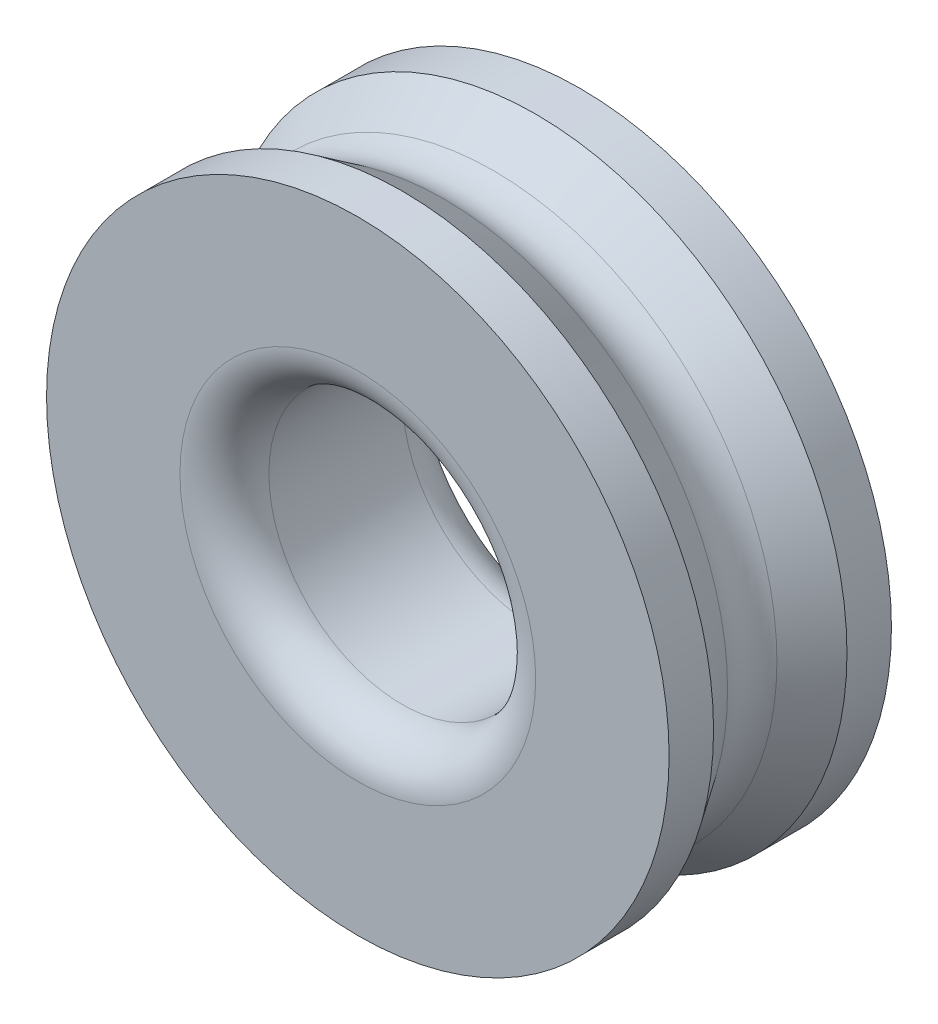
ISO-10303-21;
HEADER;
FILE_DESCRIPTION(('STEP AP214'),'2;1');
FILE_NAME('part.step','',(''),(''),'','','');
FILE_SCHEMA(('AUTOMOTIVE_DESIGN { 1 0 10303 214 1 1 1 1 }'));
ENDSEC;
DATA;
#1=APPLICATION_CONTEXT('core data for automotive mechanical design processes');
#2=APPLICATION_PROTOCOL_DEFINITION('international standard','automotive_design',2000,#1);
#3=PRODUCT_CONTEXT('',#1,'mechanical');
#4=PRODUCT('Part','Part','',(#3));
#5=PRODUCT_RELATED_PRODUCT_CATEGORY('part','',(#4));
#6=PRODUCT_DEFINITION_FORMATION('','',#4);
#7=PRODUCT_DEFINITION_CONTEXT('part definition',#1,'design');
#8=PRODUCT_DEFINITION('design','',#6,#7);
#9=PRODUCT_DEFINITION_SHAPE('','',#8);
#10=(LENGTH_UNIT() NAMED_UNIT(*) SI_UNIT(.MILLI.,.METRE.));
#11=(NAMED_UNIT(*) PLANE_ANGLE_UNIT() SI_UNIT($,.RADIAN.));
#12=(NAMED_UNIT(*) SI_UNIT($,.STERADIAN.) SOLID_ANGLE_UNIT());
#13=UNCERTAINTY_MEASURE_WITH_UNIT(LENGTH_MEASURE(1.E-05),#10,'distance_accuracy_value','');
#14=(GEOMETRIC_REPRESENTATION_CONTEXT(3) GLOBAL_UNCERTAINTY_ASSIGNED_CONTEXT((#13)) GLOBAL_UNIT_ASSIGNED_CONTEXT((#10,
#11,#12)) REPRESENTATION_CONTEXT('',''));
#15=CARTESIAN_POINT('',(0.,0.,0.));
#16=DIRECTION('',(0.,0.,1.));
#17=DIRECTION('',(1.,0.,0.));
#18=AXIS2_PLACEMENT_3D('',#15,#16,#17);
#19=CARTESIAN_POINT('',(0.,0.,0.));
#20=DIRECTION('',(0.,0.,1.));
#21=DIRECTION('',(1.,0.,0.));
#22=AXIS2_PLACEMENT_3D('',#19,#20,#21);
#23=CONICAL_SURFACE('',#22,7.,0.588002603547568);
#24=CARTESIAN_POINT('',(0.,0.,-0.94529980377477));
#25=DIRECTION('',(0.,0.,1.));
#26=DIRECTION('',(1.,0.,0.));
#27=AXIS2_PLACEMENT_3D('',#24,#25,#26);
#28=CIRCLE('',#27,6.36980013081682);
#29=CARTESIAN_POINT('',(6.36980013081682,0.,-0.94529980377477));
#30=VERTEX_POINT('',#29);
#31=EDGE_CURVE('E52',#30,#30,#28,.T.);
#32=ORIENTED_EDGE('',*,*,#31,.T.);
#33=EDGE_LOOP('',(#32));
#34=FACE_BOUND('',#33,.T.);
#35=CARTESIAN_POINT('',(0.,0.,0.));
#36=DIRECTION('',(0.,0.,1.));
#37=DIRECTION('',(1.,0.,0.));
#38=AXIS2_PLACEMENT_3D('',#35,#36,#37);
#39=CIRCLE('',#38,7.);
#40=CARTESIAN_POINT('',(7.,0.,0.));
#41=VERTEX_POINT('',#40);
#42=EDGE_CURVE('E55',#41,#41,#39,.T.);
#43=ORIENTED_EDGE('',*,*,#42,.F.);
#44=EDGE_LOOP('',(#43));
#45=FACE_BOUND('',#44,.T.);
#46=ADVANCED_FACE('F29',(#34,#45),#23,.T.);
#47=CARTESIAN_POINT('',(0.,0.,-1.5));
#48=DIRECTION('',(0.,0.,-1.));
#49=DIRECTION('',(-1.,0.,0.));
#50=AXIS2_PLACEMENT_3D('',#47,#48,#49);
#51=CONICAL_SURFACE('',#50,6.,0.588002603547568);
#52=CARTESIAN_POINT('',(0.,0.,-2.05470019622523));
#53=DIRECTION('',(0.,0.,-1.));
#54=DIRECTION('',(-1.,0.,0.));
#55=AXIS2_PLACEMENT_3D('',#52,#53,#54);
#56=CIRCLE('',#55,6.36980013081682);
#57=CARTESIAN_POINT('',(-6.36980013081682,0.,-2.05470019622523));
#58=VERTEX_POINT('',#57);
#59=EDGE_CURVE('E49',#58,#58,#56,.T.);
#60=ORIENTED_EDGE('',*,*,#59,.T.);
#61=EDGE_LOOP('',(#60));
#62=FACE_BOUND('',#61,.T.);
#63=CARTESIAN_POINT('',(0.,0.,-3.));
#64=DIRECTION('',(0.,0.,-1.));
#65=DIRECTION('',(-1.,0.,0.));
#66=AXIS2_PLACEMENT_3D('',#63,#64,#65);
#67=CIRCLE('',#66,7.);
#68=CARTESIAN_POINT('',(-7.,0.,-3.));
#69=VERTEX_POINT('',#68);
#70=EDGE_CURVE('E59',#69,#69,#67,.T.);
#71=ORIENTED_EDGE('',*,*,#70,.F.);
#72=EDGE_LOOP('',(#71));
#73=FACE_BOUND('',#72,.T.);
#74=ADVANCED_FACE('F78',(#62,#73),#51,.T.);
#75=CARTESIAN_POINT('',(0.,0.,-4.));
#76=DIRECTION('',(0.,0.,1.));
#77=DIRECTION('',(1.,0.,0.));
#78=AXIS2_PLACEMENT_3D('',#75,#76,#77);
#79=CYLINDRICAL_SURFACE('',#78,7.);
#80=CARTESIAN_POINT('',(0.,0.,-4.));
#81=DIRECTION('',(0.,0.,-1.));
#82=DIRECTION('',(-1.,0.,0.));
#83=AXIS2_PLACEMENT_3D('',#80,#81,#82);
#84=CIRCLE('',#83,7.);
#85=CARTESIAN_POINT('',(-7.,0.,-4.));
#86=VERTEX_POINT('',#85);
#87=EDGE_CURVE('E58',#86,#86,#84,.T.);
#88=ORIENTED_EDGE('',*,*,#87,.F.);
#89=EDGE_LOOP('',(#88));
#90=FACE_BOUND('',#89,.T.);
#91=ORIENTED_EDGE('',*,*,#70,.T.);
#92=EDGE_LOOP('',(#91));
#93=FACE_BOUND('',#92,.T.);
#94=ADVANCED_FACE('F84',(#90,#93),#79,.T.);
#95=CARTESIAN_POINT('',(0.,0.,-4.));
#96=DIRECTION('',(0.,0.,-1.));
#97=DIRECTION('',(-1.,0.,0.));
#98=AXIS2_PLACEMENT_3D('',#95,#96,#97);
#99=PLANE('',#98);
#100=CARTESIAN_POINT('',(0.,0.,-4.));
#101=DIRECTION('',(0.,0.,-1.));
#102=DIRECTION('',(-1.,0.,0.));
#103=AXIS2_PLACEMENT_3D('',#100,#101,#102);
#104=CIRCLE('',#103,4.);
#105=CARTESIAN_POINT('',(-4.,0.,-4.));
#106=VERTEX_POINT('',#105);
#107=EDGE_CURVE('E36',#106,#106,#104,.F.);
#108=ORIENTED_EDGE('',*,*,#107,.T.);
#109=EDGE_LOOP('',(#108));
#110=FACE_BOUND('',#109,.T.);
#111=ORIENTED_EDGE('',*,*,#87,.T.);
#112=EDGE_LOOP('',(#111));
#113=FACE_BOUND('',#112,.T.);
#114=ADVANCED_FACE('F73',(#110,#113),#99,.T.);
#115=CARTESIAN_POINT('',(0.,0.,1.));
#116=DIRECTION('',(0.,0.,-1.));
#117=DIRECTION('',(-1.,0.,0.));
#118=AXIS2_PLACEMENT_3D('',#115,#116,#117);
#119=CYLINDRICAL_SURFACE('',#118,7.);
#120=CARTESIAN_POINT('',(0.,0.,1.));
#121=DIRECTION('',(0.,0.,1.));
#122=DIRECTION('',(1.,0.,0.));
#123=AXIS2_PLACEMENT_3D('',#120,#121,#122);
#124=CIRCLE('',#123,7.);
#125=CARTESIAN_POINT('',(7.,0.,1.));
#126=VERTEX_POINT('',#125);
#127=EDGE_CURVE('E62',#126,#126,#124,.T.);
#128=ORIENTED_EDGE('',*,*,#127,.F.);
#129=EDGE_LOOP('',(#128));
#130=FACE_BOUND('',#129,.T.);
#131=ORIENTED_EDGE('',*,*,#42,.T.);
#132=EDGE_LOOP('',(#131));
#133=FACE_BOUND('',#132,.T.);
#134=ADVANCED_FACE('F70',(#130,#133),#119,.T.);
#135=CARTESIAN_POINT('',(0.,0.,1.));
#136=DIRECTION('',(0.,0.,1.));
#137=DIRECTION('',(1.,0.,0.));
#138=AXIS2_PLACEMENT_3D('',#135,#136,#137);
#139=PLANE('',#138);
#140=CARTESIAN_POINT('',(0.,0.,1.));
#141=DIRECTION('',(0.,0.,1.));
#142=DIRECTION('',(1.,0.,0.));
#143=AXIS2_PLACEMENT_3D('',#140,#141,#142);
#144=CIRCLE('',#143,4.);
#145=CARTESIAN_POINT('',(4.,0.,1.));
#146=VERTEX_POINT('',#145);
#147=EDGE_CURVE('E10',#146,#146,#144,.F.);
#148=ORIENTED_EDGE('',*,*,#147,.T.);
#149=EDGE_LOOP('',(#148));
#150=FACE_BOUND('',#149,.T.);
#151=ORIENTED_EDGE('',*,*,#127,.T.);
#152=EDGE_LOOP('',(#151));
#153=FACE_BOUND('',#152,.T.);
#154=ADVANCED_FACE('F68',(#150,#153),#139,.T.);
#155=CARTESIAN_POINT('',(0.,0.,1.));
#156=DIRECTION('',(0.,0.,-1.));
#157=DIRECTION('',(-1.,0.,0.));
#158=AXIS2_PLACEMENT_3D('',#155,#156,#157);
#159=CYLINDRICAL_SURFACE('',#158,3.);
#160=CARTESIAN_POINT('',(0.,0.,-3.));
#161=DIRECTION('',(0.,0.,-1.));
#162=DIRECTION('',(-1.,0.,0.));
#163=AXIS2_PLACEMENT_3D('',#160,#161,#162);
#164=CIRCLE('',#163,3.);
#165=CARTESIAN_POINT('',(-3.,0.,-3.));
#166=VERTEX_POINT('',#165);
#167=EDGE_CURVE('E40',#166,#166,#164,.T.);
#168=ORIENTED_EDGE('',*,*,#167,.T.);
#169=EDGE_LOOP('',(#168));
#170=FACE_BOUND('',#169,.T.);
#171=CARTESIAN_POINT('',(0.,0.,0.));
#172=DIRECTION('',(0.,0.,1.));
#173=DIRECTION('',(1.,0.,0.));
#174=AXIS2_PLACEMENT_3D('',#171,#172,#173);
#175=CIRCLE('',#174,3.);
#176=CARTESIAN_POINT('',(3.,0.,0.));
#177=VERTEX_POINT('',#176);
#178=EDGE_CURVE('E44',#177,#177,#175,.T.);
#179=ORIENTED_EDGE('',*,*,#178,.T.);
#180=EDGE_LOOP('',(#179));
#181=FACE_BOUND('',#180,.T.);
#182=ADVANCED_FACE('F92',(#170,#181),#159,.F.);
#183=CARTESIAN_POINT('',(0.,0.,-1.5));
#184=DIRECTION('',(0.,0.,1.));
#185=DIRECTION('',(1.,0.,0.));
#186=AXIS2_PLACEMENT_3D('',#183,#184,#185);
#187=TOROIDAL_SURFACE('',#186,7.20185042515466,1.);
#188=ORIENTED_EDGE('',*,*,#59,.F.);
#189=EDGE_LOOP('',(#188));
#190=FACE_BOUND('',#189,.T.);
#191=ORIENTED_EDGE('',*,*,#31,.F.);
#192=EDGE_LOOP('',(#191));
#193=FACE_BOUND('',#192,.T.);
#194=ADVANCED_FACE('F89',(#190,#193),#187,.F.);
#195=CARTESIAN_POINT('',(0.,0.,-3.));
#196=DIRECTION('',(0.,0.,-1.));
#197=DIRECTION('',(-1.,0.,0.));
#198=AXIS2_PLACEMENT_3D('',#195,#196,#197);
#199=TOROIDAL_SURFACE('',#198,4.,1.);
#200=ORIENTED_EDGE('',*,*,#107,.F.);
#201=EDGE_LOOP('',(#200));
#202=FACE_BOUND('',#201,.T.);
#203=ORIENTED_EDGE('',*,*,#167,.F.);
#204=EDGE_LOOP('',(#203));
#205=FACE_BOUND('',#204,.T.);
#206=ADVANCED_FACE('F91',(#202,#205),#199,.T.);
#207=CARTESIAN_POINT('',(0.,0.,0.));
#208=DIRECTION('',(0.,0.,1.));
#209=DIRECTION('',(1.,0.,0.));
#210=AXIS2_PLACEMENT_3D('',#207,#208,#209);
#211=TOROIDAL_SURFACE('',#210,4.,1.);
#212=ORIENTED_EDGE('',*,*,#178,.F.);
#213=EDGE_LOOP('',(#212));
#214=FACE_BOUND('',#213,.T.);
#215=ORIENTED_EDGE('',*,*,#147,.F.);
#216=EDGE_LOOP('',(#215));
#217=FACE_BOUND('',#216,.T.);
#218=ADVANCED_FACE('F31',(#214,#217),#211,.T.);
#219=CLOSED_SHELL('',(#46,#74,#94,#114,#134,#154,#182,#194,#206,#218));
#220=MANIFOLD_SOLID_BREP('B2',#219);
#221=ADVANCED_BREP_SHAPE_REPRESENTATION('',(#18,#220),#14);
#222=SHAPE_DEFINITION_REPRESENTATION(#9,#221);
ENDSEC;
END-ISO-10303-21;
